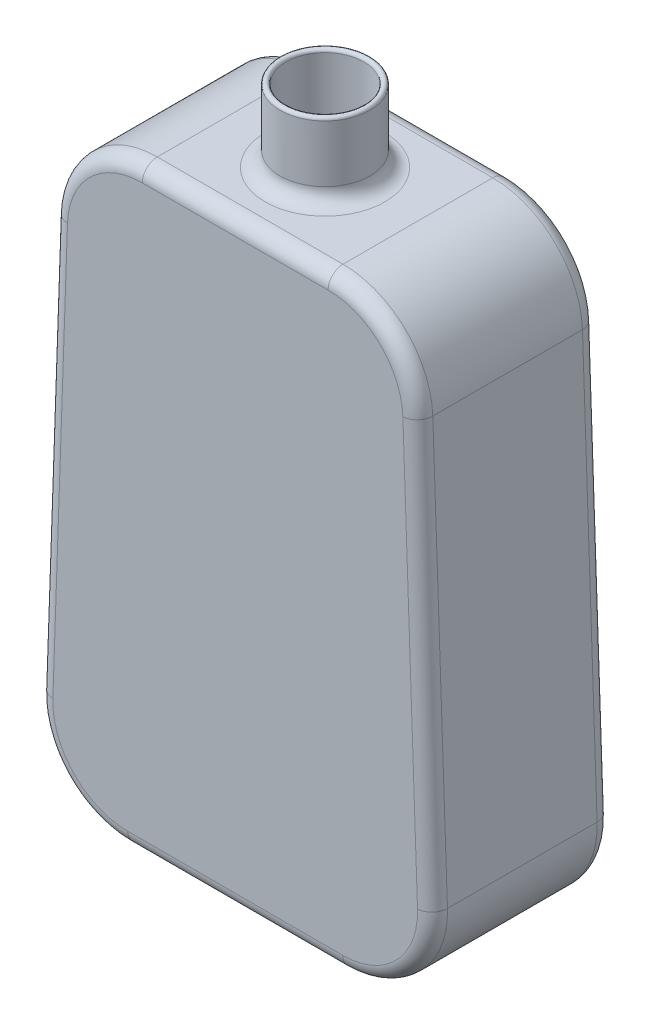
ISO-10303-21;
HEADER;
FILE_DESCRIPTION(('STEP AP214'),'2;1');
FILE_NAME('part.step','',(''),(''),'','','');
FILE_SCHEMA(('AUTOMOTIVE_DESIGN { 1 0 10303 214 1 1 1 1 }'));
ENDSEC;
DATA;
#1=APPLICATION_CONTEXT('core data for automotive mechanical design processes');
#2=APPLICATION_PROTOCOL_DEFINITION('international standard','automotive_design',2000,#1);
#3=PRODUCT_CONTEXT('',#1,'mechanical');
#4=PRODUCT('Part','Part','',(#3));
#5=PRODUCT_RELATED_PRODUCT_CATEGORY('part','',(#4));
#6=PRODUCT_DEFINITION_FORMATION('','',#4);
#7=PRODUCT_DEFINITION_CONTEXT('part definition',#1,'design');
#8=PRODUCT_DEFINITION('design','',#6,#7);
#9=PRODUCT_DEFINITION_SHAPE('','',#8);
#10=(LENGTH_UNIT() NAMED_UNIT(*) SI_UNIT(.MILLI.,.METRE.));
#11=(NAMED_UNIT(*) PLANE_ANGLE_UNIT() SI_UNIT($,.RADIAN.));
#12=(NAMED_UNIT(*) SI_UNIT($,.STERADIAN.) SOLID_ANGLE_UNIT());
#13=UNCERTAINTY_MEASURE_WITH_UNIT(LENGTH_MEASURE(1.E-05),#10,'distance_accuracy_value','');
#14=(GEOMETRIC_REPRESENTATION_CONTEXT(3) GLOBAL_UNCERTAINTY_ASSIGNED_CONTEXT((#13)) GLOBAL_UNIT_ASSIGNED_CONTEXT((#10,
#11,#12)) REPRESENTATION_CONTEXT('',''));
#15=CARTESIAN_POINT('',(0.,0.,0.));
#16=DIRECTION('',(0.,0.,1.));
#17=DIRECTION('',(1.,0.,0.));
#18=AXIS2_PLACEMENT_3D('',#15,#16,#17);
#19=CARTESIAN_POINT('',(0.,124.,0.));
#20=DIRECTION('',(0.,1.,0.));
#21=DIRECTION('',(-1.,0.,0.));
#22=AXIS2_PLACEMENT_3D('',#19,#20,#21);
#23=TOROIDAL_SURFACE('',#22,14.,1.);
#24=CARTESIAN_POINT('',(0.,124.,0.));
#25=DIRECTION('',(0.,1.,0.));
#26=DIRECTION('',(-1.,0.,0.));
#27=AXIS2_PLACEMENT_3D('',#24,#25,#26);
#28=CIRCLE('',#27,13.);
#29=CARTESIAN_POINT('',(-13.,124.,0.));
#30=VERTEX_POINT('',#29);
#31=EDGE_CURVE('E50',#30,#30,#28,.T.);
#32=ORIENTED_EDGE('',*,*,#31,.F.);
#33=EDGE_LOOP('',(#32));
#34=FACE_BOUND('',#33,.T.);
#35=CARTESIAN_POINT('',(0.,124.,0.));
#36=DIRECTION('',(0.,1.,0.));
#37=DIRECTION('',(-1.,0.,0.));
#38=AXIS2_PLACEMENT_3D('',#35,#36,#37);
#39=CIRCLE('',#38,15.);
#40=CARTESIAN_POINT('',(-15.,124.,0.));
#41=VERTEX_POINT('',#40);
#42=EDGE_CURVE('E11',#41,#41,#39,.F.);
#43=ORIENTED_EDGE('',*,*,#42,.F.);
#44=EDGE_LOOP('',(#43));
#45=FACE_BOUND('',#44,.T.);
#46=ADVANCED_FACE('F41',(#34,#45),#23,.T.);
#47=CARTESIAN_POINT('',(-60.,100.,30.));
#48=DIRECTION('',(0.999390827019096,-0.0348994967025008,0.));
#49=DIRECTION('',(0.0348994967025008,0.999390827019096,0.));
#50=AXIS2_PLACEMENT_3D('',#47,#48,#49);
#51=PLANE('',#50);
#52=DIRECTION('',(0.,0.,-1.));
#53=VECTOR('',#52,1.);
#54=CARTESIAN_POINT('',(-61.0110615663607,71.046984901075,30.));
#55=LINE('',#54,#53);
#56=CARTESIAN_POINT('',(-61.0110615663607,71.046984901075,25.));
#57=VERTEX_POINT('',#56);
#58=CARTESIAN_POINT('',(-61.0110615663607,71.046984901075,-25.));
#59=VERTEX_POINT('',#58);
#60=EDGE_CURVE('E330',#57,#59,#55,.T.);
#61=ORIENTED_EDGE('',*,*,#60,.T.);
#62=DIRECTION('',(-0.0348994967025008,-0.999390827019096,0.));
#63=VECTOR('',#62,1.);
#64=CARTESIAN_POINT('',(-60.,100.,-25.));
#65=LINE('',#64,#63);
#66=CARTESIAN_POINT('',(-65.8999692952053,-68.953015098925,-25.));
#67=VERTEX_POINT('',#66);
#68=EDGE_CURVE('E394',#59,#67,#65,.T.);
#69=ORIENTED_EDGE('',*,*,#68,.T.);
#70=DIRECTION('',(0.,0.,-1.));
#71=VECTOR('',#70,1.);
#72=CARTESIAN_POINT('',(-65.8999692952053,-68.953015098925,30.));
#73=LINE('',#72,#71);
#74=CARTESIAN_POINT('',(-65.8999692952053,-68.953015098925,25.));
#75=VERTEX_POINT('',#74);
#76=EDGE_CURVE('E314',#75,#67,#73,.T.);
#77=ORIENTED_EDGE('',*,*,#76,.F.);
#78=DIRECTION('',(-0.0348994967025008,-0.999390827019096,0.));
#79=VECTOR('',#78,1.);
#80=CARTESIAN_POINT('',(-61.0110615663607,71.046984901075,25.));
#81=LINE('',#80,#79);
#82=EDGE_CURVE('E391',#75,#57,#81,.F.);
#83=ORIENTED_EDGE('',*,*,#82,.T.);
#84=EDGE_LOOP('',(#61,#69,#77,#83));
#85=FACE_BOUND('',#84,.T.);
#86=ADVANCED_FACE('F507',(#85),#51,.F.);
#87=CARTESIAN_POINT('',(-35.9182444846325,-70.,30.));
#88=DIRECTION('',(0.,0.,-1.));
#89=DIRECTION('',(-1.,0.,0.));
#90=AXIS2_PLACEMENT_3D('',#87,#88,#89);
#91=CYLINDRICAL_SURFACE('',#90,30.);
#92=ORIENTED_EDGE('',*,*,#76,.T.);
#93=CARTESIAN_POINT('',(-35.9182444846325,-70.,-25.));
#94=DIRECTION('',(0.,0.,1.));
#95=DIRECTION('',(1.,0.,0.));
#96=AXIS2_PLACEMENT_3D('',#93,#94,#95);
#97=CIRCLE('',#96,30.);
#98=CARTESIAN_POINT('',(-35.9182444846325,-100.,-25.));
#99=VERTEX_POINT('',#98);
#100=EDGE_CURVE('E388',#67,#99,#97,.T.);
#101=ORIENTED_EDGE('',*,*,#100,.T.);
#102=DIRECTION('',(0.,0.,-1.));
#103=VECTOR('',#102,1.);
#104=CARTESIAN_POINT('',(-35.9182444846325,-100.,30.));
#105=LINE('',#104,#103);
#106=CARTESIAN_POINT('',(-35.9182444846325,-100.,25.));
#107=VERTEX_POINT('',#106);
#108=EDGE_CURVE('E310',#107,#99,#105,.T.);
#109=ORIENTED_EDGE('',*,*,#108,.F.);
#110=CARTESIAN_POINT('',(-35.9182444846325,-70.,25.));
#111=DIRECTION('',(0.,0.,1.));
#112=DIRECTION('',(1.,0.,0.));
#113=AXIS2_PLACEMENT_3D('',#110,#111,#112);
#114=CIRCLE('',#113,30.);
#115=EDGE_CURVE('E385',#107,#75,#114,.F.);
#116=ORIENTED_EDGE('',*,*,#115,.T.);
#117=EDGE_LOOP('',(#92,#101,#109,#116));
#118=FACE_BOUND('',#117,.T.);
#119=ADVANCED_FACE('F598',(#118),#91,.T.);
#120=CARTESIAN_POINT('',(-35.9182444846325,-100.,30.));
#121=DIRECTION('',(0.,1.,0.));
#122=DIRECTION('',(0.,0.,1.));
#123=AXIS2_PLACEMENT_3D('',#120,#121,#122);
#124=PLANE('',#123);
#125=ORIENTED_EDGE('',*,*,#108,.T.);
#126=DIRECTION('',(1.,0.,0.));
#127=VECTOR('',#126,1.);
#128=CARTESIAN_POINT('',(-35.9182444846325,-100.,-25.));
#129=LINE('',#128,#127);
#130=CARTESIAN_POINT('',(35.9182444846325,-100.,-25.));
#131=VERTEX_POINT('',#130);
#132=EDGE_CURVE('E382',#99,#131,#129,.T.);
#133=ORIENTED_EDGE('',*,*,#132,.T.);
#134=DIRECTION('',(0.,0.,-1.));
#135=VECTOR('',#134,1.);
#136=CARTESIAN_POINT('',(35.9182444846325,-100.,30.));
#137=LINE('',#136,#135);
#138=CARTESIAN_POINT('',(35.9182444846325,-100.,25.));
#139=VERTEX_POINT('',#138);
#140=EDGE_CURVE('E306',#139,#131,#137,.T.);
#141=ORIENTED_EDGE('',*,*,#140,.F.);
#142=DIRECTION('',(1.,0.,0.));
#143=VECTOR('',#142,1.);
#144=CARTESIAN_POINT('',(-35.9182444846325,-100.,25.));
#145=LINE('',#144,#143);
#146=EDGE_CURVE('E379',#139,#107,#145,.F.);
#147=ORIENTED_EDGE('',*,*,#146,.T.);
#148=EDGE_LOOP('',(#125,#133,#141,#147));
#149=FACE_BOUND('',#148,.T.);
#150=ADVANCED_FACE('F602',(#149),#124,.F.);
#151=CARTESIAN_POINT('',(35.9182444846325,-70.,30.));
#152=DIRECTION('',(0.,0.,-1.));
#153=DIRECTION('',(-1.,0.,0.));
#154=AXIS2_PLACEMENT_3D('',#151,#152,#153);
#155=CYLINDRICAL_SURFACE('',#154,30.);
#156=ORIENTED_EDGE('',*,*,#140,.T.);
#157=CARTESIAN_POINT('',(35.9182444846325,-70.,-25.));
#158=DIRECTION('',(0.,0.,1.));
#159=DIRECTION('',(1.,0.,0.));
#160=AXIS2_PLACEMENT_3D('',#157,#158,#159);
#161=CIRCLE('',#160,30.);
#162=CARTESIAN_POINT('',(65.8999692952053,-68.953015098925,-25.));
#163=VERTEX_POINT('',#162);
#164=EDGE_CURVE('E376',#131,#163,#161,.T.);
#165=ORIENTED_EDGE('',*,*,#164,.T.);
#166=DIRECTION('',(0.,0.,-1.));
#167=VECTOR('',#166,1.);
#168=CARTESIAN_POINT('',(65.8999692952053,-68.953015098925,30.));
#169=LINE('',#168,#167);
#170=CARTESIAN_POINT('',(65.8999692952053,-68.953015098925,25.));
#171=VERTEX_POINT('',#170);
#172=EDGE_CURVE('E291',#171,#163,#169,.T.);
#173=ORIENTED_EDGE('',*,*,#172,.F.);
#174=CARTESIAN_POINT('',(35.9182444846325,-70.,25.));
#175=DIRECTION('',(0.,0.,1.));
#176=DIRECTION('',(1.,0.,0.));
#177=AXIS2_PLACEMENT_3D('',#174,#175,#176);
#178=CIRCLE('',#177,30.);
#179=EDGE_CURVE('E373',#171,#139,#178,.F.);
#180=ORIENTED_EDGE('',*,*,#179,.T.);
#181=EDGE_LOOP('',(#156,#165,#173,#180));
#182=FACE_BOUND('',#181,.T.);
#183=ADVANCED_FACE('F606',(#182),#155,.T.);
#184=CARTESIAN_POINT('',(60.,100.,30.));
#185=DIRECTION('',(-0.999390827019096,-0.034899496702501,0.));
#186=DIRECTION('',(0.034899496702501,-0.999390827019096,0.));
#187=AXIS2_PLACEMENT_3D('',#184,#185,#186);
#188=PLANE('',#187);
#189=ORIENTED_EDGE('',*,*,#172,.T.);
#190=DIRECTION('',(-0.034899496702501,0.999390827019096,0.));
#191=VECTOR('',#190,1.);
#192=CARTESIAN_POINT('',(60.,100.,-25.));
#193=LINE('',#192,#191);
#194=CARTESIAN_POINT('',(61.0110615663606,71.046984901075,-25.));
#195=VERTEX_POINT('',#194);
#196=EDGE_CURVE('E370',#163,#195,#193,.T.);
#197=ORIENTED_EDGE('',*,*,#196,.T.);
#198=DIRECTION('',(0.,0.,-1.));
#199=VECTOR('',#198,1.);
#200=CARTESIAN_POINT('',(61.0110615663606,71.046984901075,30.));
#201=LINE('',#200,#199);
#202=CARTESIAN_POINT('',(61.0110615663606,71.046984901075,25.));
#203=VERTEX_POINT('',#202);
#204=EDGE_CURVE('E326',#195,#203,#201,.F.);
#205=ORIENTED_EDGE('',*,*,#204,.T.);
#206=DIRECTION('',(-0.034899496702501,0.999390827019096,0.));
#207=VECTOR('',#206,1.);
#208=CARTESIAN_POINT('',(65.8999692952053,-68.953015098925,25.));
#209=LINE('',#208,#207);
#210=EDGE_CURVE('E367',#203,#171,#209,.F.);
#211=ORIENTED_EDGE('',*,*,#210,.T.);
#212=EDGE_LOOP('',(#189,#197,#205,#211));
#213=FACE_BOUND('',#212,.T.);
#214=ADVANCED_FACE('F610',(#213),#188,.F.);
#215=CARTESIAN_POINT('',(60.,100.,30.));
#216=DIRECTION('',(0.,-1.,0.));
#217=DIRECTION('',(1.,0.,0.));
#218=AXIS2_PLACEMENT_3D('',#215,#216,#217);
#219=PLANE('',#218);
#220=CARTESIAN_POINT('',(0.,100.,0.));
#221=DIRECTION('',(0.,-1.,0.));
#222=DIRECTION('',(1.,0.,0.));
#223=AXIS2_PLACEMENT_3D('',#220,#221,#222);
#224=CIRCLE('',#223,20.);
#225=CARTESIAN_POINT('',(20.,100.,0.));
#226=VERTEX_POINT('',#225);
#227=EDGE_CURVE('E425',#226,#226,#224,.T.);
#228=ORIENTED_EDGE('',*,*,#227,.T.);
#229=EDGE_LOOP('',(#228));
#230=FACE_BOUND('',#229,.T.);
#231=DIRECTION('',(0.,0.,-1.));
#232=VECTOR('',#231,1.);
#233=CARTESIAN_POINT('',(31.0293367557878,100.,30.));
#234=LINE('',#233,#232);
#235=CARTESIAN_POINT('',(31.0293367557878,100.,25.));
#236=VERTEX_POINT('',#235);
#237=CARTESIAN_POINT('',(31.0293367557878,100.,-25.));
#238=VERTEX_POINT('',#237);
#239=EDGE_CURVE('E322',#236,#238,#234,.T.);
#240=ORIENTED_EDGE('',*,*,#239,.T.);
#241=DIRECTION('',(-1.,0.,0.));
#242=VECTOR('',#241,1.);
#243=CARTESIAN_POINT('',(60.,100.,-25.));
#244=LINE('',#243,#242);
#245=CARTESIAN_POINT('',(-31.0293367557878,100.,-25.));
#246=VERTEX_POINT('',#245);
#247=EDGE_CURVE('E432',#238,#246,#244,.T.);
#248=ORIENTED_EDGE('',*,*,#247,.T.);
#249=DIRECTION('',(0.,0.,-1.));
#250=VECTOR('',#249,1.);
#251=CARTESIAN_POINT('',(-31.0293367557878,100.,30.));
#252=LINE('',#251,#250);
#253=CARTESIAN_POINT('',(-31.0293367557878,100.,25.));
#254=VERTEX_POINT('',#253);
#255=EDGE_CURVE('E318',#246,#254,#252,.F.);
#256=ORIENTED_EDGE('',*,*,#255,.T.);
#257=DIRECTION('',(-1.,0.,0.));
#258=VECTOR('',#257,1.);
#259=CARTESIAN_POINT('',(31.0293367557878,100.,25.));
#260=LINE('',#259,#258);
#261=EDGE_CURVE('E429',#254,#236,#260,.F.);
#262=ORIENTED_EDGE('',*,*,#261,.T.);
#263=EDGE_LOOP('',(#240,#248,#256,#262));
#264=FACE_BOUND('',#263,.T.);
#265=ADVANCED_FACE('F614',(#230,#264),#219,.F.);
#266=CARTESIAN_POINT('',(-35.9182444846325,-70.,30.));
#267=DIRECTION('',(0.,0.,1.));
#268=DIRECTION('',(1.,0.,0.));
#269=AXIS2_PLACEMENT_3D('',#266,#267,#268);
#270=PLANE('',#269);
#271=DIRECTION('',(-0.034899496702501,0.999390827019096,0.));
#272=VECTOR('',#271,1.);
#273=CARTESIAN_POINT('',(56.0141074312652,70.8724874175626,30.));
#274=LINE('',#273,#272);
#275=CARTESIAN_POINT('',(60.9030151601099,-69.1275125824375,30.));
#276=VERTEX_POINT('',#275);
#277=CARTESIAN_POINT('',(56.0141074312652,70.8724874175625,30.));
#278=VERTEX_POINT('',#277);
#279=EDGE_CURVE('E57',#276,#278,#274,.T.);
#280=ORIENTED_EDGE('',*,*,#279,.T.);
#281=CARTESIAN_POINT('',(31.0293367557878,70.,30.));
#282=DIRECTION('',(0.,0.,1.));
#283=DIRECTION('',(1.,0.,0.));
#284=AXIS2_PLACEMENT_3D('',#281,#282,#283);
#285=CIRCLE('',#284,25.);
#286=CARTESIAN_POINT('',(31.0293367557878,95.,30.));
#287=VERTEX_POINT('',#286);
#288=EDGE_CURVE('E422',#278,#287,#285,.T.);
#289=ORIENTED_EDGE('',*,*,#288,.T.);
#290=DIRECTION('',(-1.,0.,0.));
#291=VECTOR('',#290,1.);
#292=CARTESIAN_POINT('',(-31.0293367557878,95.,30.));
#293=LINE('',#292,#291);
#294=CARTESIAN_POINT('',(-31.0293367557878,95.,30.));
#295=VERTEX_POINT('',#294);
#296=EDGE_CURVE('E403',#287,#295,#293,.T.);
#297=ORIENTED_EDGE('',*,*,#296,.T.);
#298=CARTESIAN_POINT('',(-31.0293367557878,70.,30.));
#299=DIRECTION('',(0.,0.,1.));
#300=DIRECTION('',(1.,0.,0.));
#301=AXIS2_PLACEMENT_3D('',#298,#299,#300);
#302=CIRCLE('',#301,25.);
#303=CARTESIAN_POINT('',(-56.0141074312652,70.8724874175625,30.));
#304=VERTEX_POINT('',#303);
#305=EDGE_CURVE('E406',#295,#304,#302,.T.);
#306=ORIENTED_EDGE('',*,*,#305,.T.);
#307=DIRECTION('',(-0.0348994967025008,-0.999390827019096,0.));
#308=VECTOR('',#307,1.);
#309=CARTESIAN_POINT('',(-60.9030151601098,-69.1275125824375,30.));
#310=LINE('',#309,#308);
#311=CARTESIAN_POINT('',(-60.9030151601098,-69.1275125824375,30.));
#312=VERTEX_POINT('',#311);
#313=EDGE_CURVE('E409',#304,#312,#310,.T.);
#314=ORIENTED_EDGE('',*,*,#313,.T.);
#315=CARTESIAN_POINT('',(-35.9182444846325,-70.,30.));
#316=DIRECTION('',(0.,0.,1.));
#317=DIRECTION('',(1.,0.,0.));
#318=AXIS2_PLACEMENT_3D('',#315,#316,#317);
#319=CIRCLE('',#318,25.);
#320=CARTESIAN_POINT('',(-35.9182444846325,-95.,30.));
#321=VERTEX_POINT('',#320);
#322=EDGE_CURVE('E412',#312,#321,#319,.T.);
#323=ORIENTED_EDGE('',*,*,#322,.T.);
#324=DIRECTION('',(1.,0.,0.));
#325=VECTOR('',#324,1.);
#326=CARTESIAN_POINT('',(35.9182444846325,-95.,30.));
#327=LINE('',#326,#325);
#328=CARTESIAN_POINT('',(35.9182444846325,-95.,30.));
#329=VERTEX_POINT('',#328);
#330=EDGE_CURVE('E415',#321,#329,#327,.T.);
#331=ORIENTED_EDGE('',*,*,#330,.T.);
#332=CARTESIAN_POINT('',(35.9182444846325,-70.,30.));
#333=DIRECTION('',(0.,0.,1.));
#334=DIRECTION('',(1.,0.,0.));
#335=AXIS2_PLACEMENT_3D('',#332,#333,#334);
#336=CIRCLE('',#335,25.);
#337=EDGE_CURVE('E62',#329,#276,#336,.T.);
#338=ORIENTED_EDGE('',*,*,#337,.T.);
#339=EDGE_LOOP('',(#280,#289,#297,#306,#314,#323,#331,#338));
#340=FACE_BOUND('',#339,.T.);
#341=ADVANCED_FACE('F618',(#340),#270,.T.);
#342=CARTESIAN_POINT('',(-35.9182444846325,-70.,-30.));
#343=DIRECTION('',(0.,0.,1.));
#344=DIRECTION('',(1.,0.,0.));
#345=AXIS2_PLACEMENT_3D('',#342,#343,#344);
#346=PLANE('',#345);
#347=DIRECTION('',(-1.,0.,0.));
#348=VECTOR('',#347,1.);
#349=CARTESIAN_POINT('',(-35.9182444846325,95.,-30.));
#350=LINE('',#349,#348);
#351=CARTESIAN_POINT('',(-31.0293367557878,95.,-30.));
#352=VERTEX_POINT('',#351);
#353=CARTESIAN_POINT('',(31.0293367557878,95.,-30.));
#354=VERTEX_POINT('',#353);
#355=EDGE_CURVE('E334',#352,#354,#350,.F.);
#356=ORIENTED_EDGE('',*,*,#355,.T.);
#357=CARTESIAN_POINT('',(31.0293367557878,70.,-30.));
#358=DIRECTION('',(0.,0.,1.));
#359=DIRECTION('',(1.,0.,0.));
#360=AXIS2_PLACEMENT_3D('',#357,#358,#359);
#361=CIRCLE('',#360,25.);
#362=CARTESIAN_POINT('',(56.0141074312652,70.8724874175625,-30.));
#363=VERTEX_POINT('',#362);
#364=EDGE_CURVE('E355',#354,#363,#361,.F.);
#365=ORIENTED_EDGE('',*,*,#364,.T.);
#366=DIRECTION('',(-0.034899496702501,0.999390827019096,0.));
#367=VECTOR('',#366,1.);
#368=CARTESIAN_POINT('',(60.8155201217899,-66.6219825041101,-30.));
#369=LINE('',#368,#367);
#370=CARTESIAN_POINT('',(60.9030151601099,-69.1275125824375,-30.));
#371=VERTEX_POINT('',#370);
#372=EDGE_CURVE('E352',#363,#371,#369,.F.);
#373=ORIENTED_EDGE('',*,*,#372,.T.);
#374=CARTESIAN_POINT('',(35.9182444846325,-70.,-30.));
#375=DIRECTION('',(0.,0.,1.));
#376=DIRECTION('',(1.,0.,0.));
#377=AXIS2_PLACEMENT_3D('',#374,#375,#376);
#378=CIRCLE('',#377,25.);
#379=CARTESIAN_POINT('',(35.9182444846325,-95.,-30.));
#380=VERTEX_POINT('',#379);
#381=EDGE_CURVE('E349',#371,#380,#378,.F.);
#382=ORIENTED_EDGE('',*,*,#381,.T.);
#383=DIRECTION('',(1.,0.,0.));
#384=VECTOR('',#383,1.);
#385=CARTESIAN_POINT('',(-35.9182444846325,-95.,-30.));
#386=LINE('',#385,#384);
#387=CARTESIAN_POINT('',(-35.9182444846325,-95.,-30.));
#388=VERTEX_POINT('',#387);
#389=EDGE_CURVE('E346',#380,#388,#386,.F.);
#390=ORIENTED_EDGE('',*,*,#389,.T.);
#391=CARTESIAN_POINT('',(-35.9182444846325,-70.,-30.));
#392=DIRECTION('',(0.,0.,1.));
#393=DIRECTION('',(1.,0.,0.));
#394=AXIS2_PLACEMENT_3D('',#391,#392,#393);
#395=CIRCLE('',#394,25.);
#396=CARTESIAN_POINT('',(-60.9030151601098,-69.1275125824375,-30.));
#397=VERTEX_POINT('',#396);
#398=EDGE_CURVE('E343',#388,#397,#395,.F.);
#399=ORIENTED_EDGE('',*,*,#398,.T.);
#400=DIRECTION('',(-0.0348994967025008,-0.999390827019096,0.));
#401=VECTOR('',#400,1.);
#402=CARTESIAN_POINT('',(-60.9030151601098,-69.1275125824375,-30.));
#403=LINE('',#402,#401);
#404=CARTESIAN_POINT('',(-56.0141074312652,70.8724874175625,-30.));
#405=VERTEX_POINT('',#404);
#406=EDGE_CURVE('E340',#397,#405,#403,.F.);
#407=ORIENTED_EDGE('',*,*,#406,.T.);
#408=CARTESIAN_POINT('',(-31.0293367557878,70.,-30.));
#409=DIRECTION('',(0.,0.,1.));
#410=DIRECTION('',(1.,0.,0.));
#411=AXIS2_PLACEMENT_3D('',#408,#409,#410);
#412=CIRCLE('',#411,25.);
#413=EDGE_CURVE('E337',#405,#352,#412,.F.);
#414=ORIENTED_EDGE('',*,*,#413,.T.);
#415=EDGE_LOOP('',(#356,#365,#373,#382,#390,#399,#407,#414));
#416=FACE_BOUND('',#415,.T.);
#417=ADVANCED_FACE('F594',(#416),#346,.F.);
#418=CARTESIAN_POINT('',(31.0293367557878,70.,30.));
#419=DIRECTION('',(0.,0.,-1.));
#420=DIRECTION('',(-1.,0.,0.));
#421=AXIS2_PLACEMENT_3D('',#418,#419,#420);
#422=CYLINDRICAL_SURFACE('',#421,30.);
#423=ORIENTED_EDGE('',*,*,#204,.F.);
#424=CARTESIAN_POINT('',(31.0293367557878,70.,-25.));
#425=DIRECTION('',(0.,0.,1.));
#426=DIRECTION('',(1.,0.,0.));
#427=AXIS2_PLACEMENT_3D('',#424,#425,#426);
#428=CIRCLE('',#427,30.);
#429=EDGE_CURVE('E363',#195,#238,#428,.T.);
#430=ORIENTED_EDGE('',*,*,#429,.T.);
#431=ORIENTED_EDGE('',*,*,#239,.F.);
#432=CARTESIAN_POINT('',(31.0293367557878,70.,25.));
#433=DIRECTION('',(0.,0.,1.));
#434=DIRECTION('',(1.,0.,0.));
#435=AXIS2_PLACEMENT_3D('',#432,#433,#434);
#436=CIRCLE('',#435,30.);
#437=EDGE_CURVE('E359',#236,#203,#436,.F.);
#438=ORIENTED_EDGE('',*,*,#437,.T.);
#439=EDGE_LOOP('',(#423,#430,#431,#438));
#440=FACE_BOUND('',#439,.T.);
#441=ADVANCED_FACE('F590',(#440),#422,.T.);
#442=CARTESIAN_POINT('',(-31.0293367557878,70.,30.));
#443=DIRECTION('',(0.,0.,-1.));
#444=DIRECTION('',(-1.,0.,0.));
#445=AXIS2_PLACEMENT_3D('',#442,#443,#444);
#446=CYLINDRICAL_SURFACE('',#445,30.);
#447=ORIENTED_EDGE('',*,*,#255,.F.);
#448=CARTESIAN_POINT('',(-31.0293367557878,70.,-25.));
#449=DIRECTION('',(0.,0.,1.));
#450=DIRECTION('',(1.,0.,0.));
#451=AXIS2_PLACEMENT_3D('',#448,#449,#450);
#452=CIRCLE('',#451,30.);
#453=EDGE_CURVE('E400',#246,#59,#452,.T.);
#454=ORIENTED_EDGE('',*,*,#453,.T.);
#455=ORIENTED_EDGE('',*,*,#60,.F.);
#456=CARTESIAN_POINT('',(-31.0293367557878,70.,25.));
#457=DIRECTION('',(0.,0.,1.));
#458=DIRECTION('',(1.,0.,0.));
#459=AXIS2_PLACEMENT_3D('',#456,#457,#458);
#460=CIRCLE('',#459,30.);
#461=EDGE_CURVE('E397',#57,#254,#460,.F.);
#462=ORIENTED_EDGE('',*,*,#461,.T.);
#463=EDGE_LOOP('',(#447,#454,#455,#462));
#464=FACE_BOUND('',#463,.T.);
#465=ADVANCED_FACE('F513',(#464),#446,.T.);
#466=CARTESIAN_POINT('',(0.,125.,0.));
#467=DIRECTION('',(0.,-1.,0.));
#468=DIRECTION('',(1.,0.,0.));
#469=AXIS2_PLACEMENT_3D('',#466,#467,#468);
#470=CYLINDRICAL_SURFACE('',#469,15.);
#471=ORIENTED_EDGE('',*,*,#42,.T.);
#472=EDGE_LOOP('',(#471));
#473=FACE_BOUND('',#472,.T.);
#474=CARTESIAN_POINT('',(0.,105.,0.));
#475=DIRECTION('',(0.,-1.,0.));
#476=DIRECTION('',(1.,0.,0.));
#477=AXIS2_PLACEMENT_3D('',#474,#475,#476);
#478=CIRCLE('',#477,15.);
#479=CARTESIAN_POINT('',(15.,105.,0.));
#480=VERTEX_POINT('',#479);
#481=EDGE_CURVE('E435',#480,#480,#478,.F.);
#482=ORIENTED_EDGE('',*,*,#481,.T.);
#483=EDGE_LOOP('',(#482));
#484=FACE_BOUND('',#483,.T.);
#485=ADVANCED_FACE('F510',(#473,#484),#470,.T.);
#486=CARTESIAN_POINT('',(-58.0012183459618,99.930201006595,30.));
#487=DIRECTION('',(0.999390827019096,-0.0348994967025008,0.));
#488=DIRECTION('',(0.0348994967025008,0.999390827019096,0.));
#489=AXIS2_PLACEMENT_3D('',#486,#487,#488);
#490=PLANE('',#489);
#491=DIRECTION('',(-0.0348994967025008,-0.999390827019096,0.));
#492=VECTOR('',#491,1.);
#493=CARTESIAN_POINT('',(-58.0012183459618,99.930201006595,28.));
#494=LINE('',#493,#492);
#495=CARTESIAN_POINT('',(-59.0122799123225,70.97718590767,28.));
#496=VERTEX_POINT('',#495);
#497=CARTESIAN_POINT('',(-63.9011876411671,-69.02281409233,28.));
#498=VERTEX_POINT('',#497);
#499=EDGE_CURVE('E204',#496,#498,#494,.T.);
#500=ORIENTED_EDGE('',*,*,#499,.T.);
#501=DIRECTION('',(0.,0.,-1.));
#502=VECTOR('',#501,1.);
#503=CARTESIAN_POINT('',(-63.9011876411671,-69.02281409233,30.));
#504=LINE('',#503,#502);
#505=CARTESIAN_POINT('',(-63.9011876411671,-69.02281409233,-28.));
#506=VERTEX_POINT('',#505);
#507=EDGE_CURVE('E209',#498,#506,#504,.T.);
#508=ORIENTED_EDGE('',*,*,#507,.T.);
#509=DIRECTION('',(-0.0348994967025008,-0.999390827019096,0.));
#510=VECTOR('',#509,1.);
#511=CARTESIAN_POINT('',(-58.0012183459618,99.930201006595,-28.));
#512=LINE('',#511,#510);
#513=CARTESIAN_POINT('',(-59.0122799123225,70.97718590767,-28.));
#514=VERTEX_POINT('',#513);
#515=EDGE_CURVE('E243',#514,#506,#512,.T.);
#516=ORIENTED_EDGE('',*,*,#515,.F.);
#517=DIRECTION('',(0.,0.,1.));
#518=VECTOR('',#517,1.);
#519=CARTESIAN_POINT('',(-59.0122799123225,70.97718590767,30.));
#520=LINE('',#519,#518);
#521=EDGE_CURVE('E211',#496,#514,#520,.F.);
#522=ORIENTED_EDGE('',*,*,#521,.F.);
#523=EDGE_LOOP('',(#500,#508,#516,#522));
#524=FACE_BOUND('',#523,.T.);
#525=ADVANCED_FACE('F206',(#524),#490,.T.);
#526=CARTESIAN_POINT('',(-35.9182444846325,-70.,30.));
#527=DIRECTION('',(0.,0.,-1.));
#528=DIRECTION('',(-1.,0.,0.));
#529=AXIS2_PLACEMENT_3D('',#526,#527,#528);
#530=CYLINDRICAL_SURFACE('',#529,28.);
#531=CARTESIAN_POINT('',(-35.9182444846325,-70.,-28.));
#532=DIRECTION('',(0.,0.,1.));
#533=DIRECTION('',(1.,0.,0.));
#534=AXIS2_PLACEMENT_3D('',#531,#532,#533);
#535=CIRCLE('',#534,28.);
#536=CARTESIAN_POINT('',(-35.9182444846325,-98.,-28.));
#537=VERTEX_POINT('',#536);
#538=EDGE_CURVE('E230',#506,#537,#535,.T.);
#539=ORIENTED_EDGE('',*,*,#538,.F.);
#540=ORIENTED_EDGE('',*,*,#507,.F.);
#541=CARTESIAN_POINT('',(-35.9182444846325,-70.,28.));
#542=DIRECTION('',(0.,0.,1.));
#543=DIRECTION('',(1.,0.,0.));
#544=AXIS2_PLACEMENT_3D('',#541,#542,#543);
#545=CIRCLE('',#544,28.);
#546=CARTESIAN_POINT('',(-35.9182444846325,-98.,28.));
#547=VERTEX_POINT('',#546);
#548=EDGE_CURVE('E215',#498,#547,#545,.T.);
#549=ORIENTED_EDGE('',*,*,#548,.T.);
#550=DIRECTION('',(0.,0.,1.));
#551=VECTOR('',#550,1.);
#552=CARTESIAN_POINT('',(-35.9182444846325,-98.,30.));
#553=LINE('',#552,#551);
#554=EDGE_CURVE('E233',#547,#537,#553,.F.);
#555=ORIENTED_EDGE('',*,*,#554,.T.);
#556=EDGE_LOOP('',(#539,#540,#549,#555));
#557=FACE_BOUND('',#556,.T.);
#558=ADVANCED_FACE('F229',(#557),#530,.F.);
#559=CARTESIAN_POINT('',(-35.9182444846325,-98.,30.));
#560=DIRECTION('',(0.,1.,0.));
#561=DIRECTION('',(0.,0.,1.));
#562=AXIS2_PLACEMENT_3D('',#559,#560,#561);
#563=PLANE('',#562);
#564=DIRECTION('',(1.,0.,0.));
#565=VECTOR('',#564,1.);
#566=CARTESIAN_POINT('',(-35.9182444846325,-98.,-28.));
#567=LINE('',#566,#565);
#568=CARTESIAN_POINT('',(35.9182444846325,-98.,-28.));
#569=VERTEX_POINT('',#568);
#570=EDGE_CURVE('E246',#537,#569,#567,.T.);
#571=ORIENTED_EDGE('',*,*,#570,.F.);
#572=ORIENTED_EDGE('',*,*,#554,.F.);
#573=DIRECTION('',(1.,0.,0.));
#574=VECTOR('',#573,1.);
#575=CARTESIAN_POINT('',(-35.9182444846325,-98.,28.));
#576=LINE('',#575,#574);
#577=CARTESIAN_POINT('',(35.9182444846325,-98.,28.));
#578=VERTEX_POINT('',#577);
#579=EDGE_CURVE('E222',#547,#578,#576,.T.);
#580=ORIENTED_EDGE('',*,*,#579,.T.);
#581=DIRECTION('',(0.,0.,-1.));
#582=VECTOR('',#581,1.);
#583=CARTESIAN_POINT('',(35.9182444846325,-98.,30.));
#584=LINE('',#583,#582);
#585=EDGE_CURVE('E239',#578,#569,#584,.T.);
#586=ORIENTED_EDGE('',*,*,#585,.T.);
#587=EDGE_LOOP('',(#571,#572,#580,#586));
#588=FACE_BOUND('',#587,.T.);
#589=ADVANCED_FACE('F652',(#588),#563,.T.);
#590=CARTESIAN_POINT('',(35.9182444846325,-70.,30.));
#591=DIRECTION('',(0.,0.,-1.));
#592=DIRECTION('',(-1.,0.,0.));
#593=AXIS2_PLACEMENT_3D('',#590,#591,#592);
#594=CYLINDRICAL_SURFACE('',#593,28.);
#595=CARTESIAN_POINT('',(35.9182444846325,-70.,-28.));
#596=DIRECTION('',(0.,0.,1.));
#597=DIRECTION('',(1.,0.,0.));
#598=AXIS2_PLACEMENT_3D('',#595,#596,#597);
#599=CIRCLE('',#598,28.);
#600=CARTESIAN_POINT('',(63.9011876411671,-69.02281409233,-28.));
#601=VERTEX_POINT('',#600);
#602=EDGE_CURVE('E250',#569,#601,#599,.T.);
#603=ORIENTED_EDGE('',*,*,#602,.F.);
#604=ORIENTED_EDGE('',*,*,#585,.F.);
#605=CARTESIAN_POINT('',(35.9182444846325,-70.,28.));
#606=DIRECTION('',(0.,0.,1.));
#607=DIRECTION('',(1.,0.,0.));
#608=AXIS2_PLACEMENT_3D('',#605,#606,#607);
#609=CIRCLE('',#608,28.);
#610=CARTESIAN_POINT('',(63.9011876411671,-69.02281409233,28.));
#611=VERTEX_POINT('',#610);
#612=EDGE_CURVE('E257',#578,#611,#609,.T.);
#613=ORIENTED_EDGE('',*,*,#612,.T.);
#614=DIRECTION('',(0.,0.,1.));
#615=VECTOR('',#614,1.);
#616=CARTESIAN_POINT('',(63.9011876411671,-69.02281409233,30.));
#617=LINE('',#616,#615);
#618=EDGE_CURVE('E254',#611,#601,#617,.F.);
#619=ORIENTED_EDGE('',*,*,#618,.T.);
#620=EDGE_LOOP('',(#603,#604,#613,#619));
#621=FACE_BOUND('',#620,.T.);
#622=ADVANCED_FACE('F648',(#621),#594,.F.);
#623=CARTESIAN_POINT('',(58.0012183459618,99.930201006595,30.));
#624=DIRECTION('',(-0.999390827019096,-0.034899496702501,0.));
#625=DIRECTION('',(0.034899496702501,-0.999390827019096,0.));
#626=AXIS2_PLACEMENT_3D('',#623,#624,#625);
#627=PLANE('',#626);
#628=DIRECTION('',(-0.034899496702501,0.999390827019096,0.));
#629=VECTOR('',#628,1.);
#630=CARTESIAN_POINT('',(58.0012183459618,99.930201006595,-28.));
#631=LINE('',#630,#629);
#632=CARTESIAN_POINT('',(59.0122799123225,70.97718590767,-28.));
#633=VERTEX_POINT('',#632);
#634=EDGE_CURVE('E260',#601,#633,#631,.T.);
#635=ORIENTED_EDGE('',*,*,#634,.F.);
#636=ORIENTED_EDGE('',*,*,#618,.F.);
#637=DIRECTION('',(-0.034899496702501,0.999390827019096,0.));
#638=VECTOR('',#637,1.);
#639=CARTESIAN_POINT('',(58.0012183459618,99.930201006595,28.));
#640=LINE('',#639,#638);
#641=CARTESIAN_POINT('',(59.0122799123225,70.97718590767,28.));
#642=VERTEX_POINT('',#641);
#643=EDGE_CURVE('E267',#611,#642,#640,.T.);
#644=ORIENTED_EDGE('',*,*,#643,.T.);
#645=DIRECTION('',(0.,0.,1.));
#646=VECTOR('',#645,1.);
#647=CARTESIAN_POINT('',(59.0122799123225,70.97718590767,30.));
#648=LINE('',#647,#646);
#649=EDGE_CURVE('E271',#633,#642,#648,.T.);
#650=ORIENTED_EDGE('',*,*,#649,.F.);
#651=EDGE_LOOP('',(#635,#636,#644,#650));
#652=FACE_BOUND('',#651,.T.);
#653=ADVANCED_FACE('F644',(#652),#627,.T.);
#654=CARTESIAN_POINT('',(60.,98.,30.));
#655=DIRECTION('',(0.,-1.,0.));
#656=DIRECTION('',(1.,0.,0.));
#657=AXIS2_PLACEMENT_3D('',#654,#655,#656);
#658=PLANE('',#657);
#659=CARTESIAN_POINT('',(0.,98.,0.));
#660=DIRECTION('',(0.,-1.,0.));
#661=DIRECTION('',(1.,0.,0.));
#662=AXIS2_PLACEMENT_3D('',#659,#660,#661);
#663=CIRCLE('',#662,13.);
#664=CARTESIAN_POINT('',(13.,98.,0.));
#665=VERTEX_POINT('',#664);
#666=EDGE_CURVE('E287',#665,#665,#663,.F.);
#667=ORIENTED_EDGE('',*,*,#666,.T.);
#668=EDGE_LOOP('',(#667));
#669=FACE_BOUND('',#668,.T.);
#670=DIRECTION('',(-1.,0.,0.));
#671=VECTOR('',#670,1.);
#672=CARTESIAN_POINT('',(60.,98.,28.));
#673=LINE('',#672,#671);
#674=CARTESIAN_POINT('',(31.0293367557878,98.,28.));
#675=VERTEX_POINT('',#674);
#676=CARTESIAN_POINT('',(-31.0293367557878,98.,28.));
#677=VERTEX_POINT('',#676);
#678=EDGE_CURVE('E264',#675,#677,#673,.T.);
#679=ORIENTED_EDGE('',*,*,#678,.T.);
#680=DIRECTION('',(0.,0.,1.));
#681=VECTOR('',#680,1.);
#682=CARTESIAN_POINT('',(-31.0293367557878,98.,30.));
#683=LINE('',#682,#681);
#684=CARTESIAN_POINT('',(-31.0293367557878,98.,-28.));
#685=VERTEX_POINT('',#684);
#686=EDGE_CURVE('E232',#685,#677,#683,.T.);
#687=ORIENTED_EDGE('',*,*,#686,.F.);
#688=DIRECTION('',(-1.,0.,0.));
#689=VECTOR('',#688,1.);
#690=CARTESIAN_POINT('',(60.,98.,-28.));
#691=LINE('',#690,#689);
#692=CARTESIAN_POINT('',(31.0293367557878,98.,-28.));
#693=VERTEX_POINT('',#692);
#694=EDGE_CURVE('E216',#693,#685,#691,.T.);
#695=ORIENTED_EDGE('',*,*,#694,.F.);
#696=DIRECTION('',(0.,0.,1.));
#697=VECTOR('',#696,1.);
#698=CARTESIAN_POINT('',(31.0293367557878,98.,30.));
#699=LINE('',#698,#697);
#700=EDGE_CURVE('E237',#675,#693,#699,.F.);
#701=ORIENTED_EDGE('',*,*,#700,.F.);
#702=EDGE_LOOP('',(#679,#687,#695,#701));
#703=FACE_BOUND('',#702,.T.);
#704=ADVANCED_FACE('F641',(#669,#703),#658,.T.);
#705=CARTESIAN_POINT('',(-35.9182444846325,-70.,28.));
#706=DIRECTION('',(0.,0.,1.));
#707=DIRECTION('',(1.,0.,0.));
#708=AXIS2_PLACEMENT_3D('',#705,#706,#707);
#709=PLANE('',#708);
#710=ORIENTED_EDGE('',*,*,#643,.F.);
#711=ORIENTED_EDGE('',*,*,#612,.F.);
#712=ORIENTED_EDGE('',*,*,#579,.F.);
#713=ORIENTED_EDGE('',*,*,#548,.F.);
#714=ORIENTED_EDGE('',*,*,#499,.F.);
#715=CARTESIAN_POINT('',(-31.0293367557878,70.,28.));
#716=DIRECTION('',(0.,0.,1.));
#717=DIRECTION('',(1.,0.,0.));
#718=AXIS2_PLACEMENT_3D('',#715,#716,#717);
#719=CIRCLE('',#718,28.);
#720=EDGE_CURVE('E274',#677,#496,#719,.T.);
#721=ORIENTED_EDGE('',*,*,#720,.F.);
#722=ORIENTED_EDGE('',*,*,#678,.F.);
#723=CARTESIAN_POINT('',(31.0293367557878,70.,28.));
#724=DIRECTION('',(0.,0.,1.));
#725=DIRECTION('',(1.,0.,0.));
#726=AXIS2_PLACEMENT_3D('',#723,#724,#725);
#727=CIRCLE('',#726,28.);
#728=EDGE_CURVE('E279',#642,#675,#727,.T.);
#729=ORIENTED_EDGE('',*,*,#728,.F.);
#730=EDGE_LOOP('',(#710,#711,#712,#713,#714,#721,#722,#729));
#731=FACE_BOUND('',#730,.T.);
#732=ADVANCED_FACE('F220',(#731),#709,.F.);
#733=CARTESIAN_POINT('',(-35.9182444846325,-70.,-28.));
#734=DIRECTION('',(0.,0.,1.));
#735=DIRECTION('',(1.,0.,0.));
#736=AXIS2_PLACEMENT_3D('',#733,#734,#735);
#737=PLANE('',#736);
#738=ORIENTED_EDGE('',*,*,#694,.T.);
#739=CARTESIAN_POINT('',(-31.0293367557878,70.,-28.));
#740=DIRECTION('',(0.,0.,1.));
#741=DIRECTION('',(1.,0.,0.));
#742=AXIS2_PLACEMENT_3D('',#739,#740,#741);
#743=CIRCLE('',#742,28.);
#744=EDGE_CURVE('E295',#514,#685,#743,.F.);
#745=ORIENTED_EDGE('',*,*,#744,.F.);
#746=ORIENTED_EDGE('',*,*,#515,.T.);
#747=ORIENTED_EDGE('',*,*,#538,.T.);
#748=ORIENTED_EDGE('',*,*,#570,.T.);
#749=ORIENTED_EDGE('',*,*,#602,.T.);
#750=ORIENTED_EDGE('',*,*,#634,.T.);
#751=CARTESIAN_POINT('',(31.0293367557878,70.,-28.));
#752=DIRECTION('',(0.,0.,1.));
#753=DIRECTION('',(1.,0.,0.));
#754=AXIS2_PLACEMENT_3D('',#751,#752,#753);
#755=CIRCLE('',#754,28.);
#756=EDGE_CURVE('E275',#693,#633,#755,.F.);
#757=ORIENTED_EDGE('',*,*,#756,.F.);
#758=EDGE_LOOP('',(#738,#745,#746,#747,#748,#749,#750,#757));
#759=FACE_BOUND('',#758,.T.);
#760=ADVANCED_FACE('F634',(#759),#737,.T.);
#761=CARTESIAN_POINT('',(31.0293367557878,70.,30.));
#762=DIRECTION('',(0.,0.,-1.));
#763=DIRECTION('',(-1.,0.,0.));
#764=AXIS2_PLACEMENT_3D('',#761,#762,#763);
#765=CYLINDRICAL_SURFACE('',#764,28.);
#766=ORIENTED_EDGE('',*,*,#728,.T.);
#767=ORIENTED_EDGE('',*,*,#700,.T.);
#768=ORIENTED_EDGE('',*,*,#756,.T.);
#769=ORIENTED_EDGE('',*,*,#649,.T.);
#770=EDGE_LOOP('',(#766,#767,#768,#769));
#771=FACE_BOUND('',#770,.T.);
#772=ADVANCED_FACE('F630',(#771),#765,.F.);
#773=CARTESIAN_POINT('',(-31.0293367557878,70.,30.));
#774=DIRECTION('',(0.,0.,-1.));
#775=DIRECTION('',(-1.,0.,0.));
#776=AXIS2_PLACEMENT_3D('',#773,#774,#775);
#777=CYLINDRICAL_SURFACE('',#776,28.);
#778=ORIENTED_EDGE('',*,*,#720,.T.);
#779=ORIENTED_EDGE('',*,*,#521,.T.);
#780=ORIENTED_EDGE('',*,*,#744,.T.);
#781=ORIENTED_EDGE('',*,*,#686,.T.);
#782=EDGE_LOOP('',(#778,#779,#780,#781));
#783=FACE_BOUND('',#782,.T.);
#784=ADVANCED_FACE('F627',(#783),#777,.F.);
#785=CARTESIAN_POINT('',(0.,125.,0.));
#786=DIRECTION('',(0.,-1.,0.));
#787=DIRECTION('',(1.,0.,0.));
#788=AXIS2_PLACEMENT_3D('',#785,#786,#787);
#789=CYLINDRICAL_SURFACE('',#788,13.);
#790=ORIENTED_EDGE('',*,*,#31,.T.);
#791=EDGE_LOOP('',(#790));
#792=FACE_BOUND('',#791,.T.);
#793=ORIENTED_EDGE('',*,*,#666,.F.);
#794=EDGE_LOOP('',(#793));
#795=FACE_BOUND('',#794,.T.);
#796=ADVANCED_FACE('F502',(#792,#795),#789,.F.);
#797=CARTESIAN_POINT('',(-35.9182444846325,-70.,-25.));
#798=DIRECTION('',(0.,0.,1.));
#799=DIRECTION('',(1.,0.,0.));
#800=AXIS2_PLACEMENT_3D('',#797,#798,#799);
#801=TOROIDAL_SURFACE('',#800,25.,5.);
#802=CARTESIAN_POINT('',(-35.9182444846325,-95.,-25.));
#803=DIRECTION('',(1.,0.,0.));
#804=DIRECTION('',(0.,0.,-1.));
#805=AXIS2_PLACEMENT_3D('',#802,#803,#804);
#806=CIRCLE('',#805,5.);
#807=EDGE_CURVE('E462',#99,#388,#806,.T.);
#808=ORIENTED_EDGE('',*,*,#807,.F.);
#809=ORIENTED_EDGE('',*,*,#100,.F.);
#810=CARTESIAN_POINT('',(-60.9030151601098,-69.1275125824375,-25.));
#811=DIRECTION('',(0.0348994967025007,0.999390827019096,0.));
#812=DIRECTION('',(-0.999390827019096,0.0348994967025007,0.));
#813=AXIS2_PLACEMENT_3D('',#810,#811,#812);
#814=CIRCLE('',#813,5.);
#815=EDGE_CURVE('E466',#397,#67,#814,.T.);
#816=ORIENTED_EDGE('',*,*,#815,.F.);
#817=ORIENTED_EDGE('',*,*,#398,.F.);
#818=EDGE_LOOP('',(#808,#809,#816,#817));
#819=FACE_BOUND('',#818,.T.);
#820=ADVANCED_FACE('F557',(#819),#801,.T.);
#821=CARTESIAN_POINT('',(-55.0030458649045,99.8255025164875,-25.));
#822=DIRECTION('',(-0.0348994967025008,-0.999390827019096,0.));
#823=DIRECTION('',(0.999390827019096,-0.0348994967025008,0.));
#824=AXIS2_PLACEMENT_3D('',#821,#822,#823);
#825=CYLINDRICAL_SURFACE('',#824,5.);
#826=ORIENTED_EDGE('',*,*,#815,.T.);
#827=ORIENTED_EDGE('',*,*,#68,.F.);
#828=CARTESIAN_POINT('',(-56.0141074312652,70.8724874175625,-25.));
#829=DIRECTION('',(0.0348994967025007,0.999390827019096,0.));
#830=DIRECTION('',(-0.999390827019096,0.0348994967025007,0.));
#831=AXIS2_PLACEMENT_3D('',#828,#829,#830);
#832=CIRCLE('',#831,5.);
#833=EDGE_CURVE('E458',#405,#59,#832,.T.);
#834=ORIENTED_EDGE('',*,*,#833,.F.);
#835=ORIENTED_EDGE('',*,*,#406,.F.);
#836=EDGE_LOOP('',(#826,#827,#834,#835));
#837=FACE_BOUND('',#836,.T.);
#838=ADVANCED_FACE('F560',(#837),#825,.T.);
#839=CARTESIAN_POINT('',(-35.9182444846325,-95.,-25.));
#840=DIRECTION('',(1.,0.,0.));
#841=DIRECTION('',(0.,0.,-1.));
#842=AXIS2_PLACEMENT_3D('',#839,#840,#841);
#843=CYLINDRICAL_SURFACE('',#842,5.);
#844=ORIENTED_EDGE('',*,*,#807,.T.);
#845=ORIENTED_EDGE('',*,*,#389,.F.);
#846=CARTESIAN_POINT('',(35.9182444846325,-95.,-25.));
#847=DIRECTION('',(1.,0.,0.));
#848=DIRECTION('',(0.,0.,-1.));
#849=AXIS2_PLACEMENT_3D('',#846,#847,#848);
#850=CIRCLE('',#849,5.);
#851=EDGE_CURVE('E454',#131,#380,#850,.T.);
#852=ORIENTED_EDGE('',*,*,#851,.F.);
#853=ORIENTED_EDGE('',*,*,#132,.F.);
#854=EDGE_LOOP('',(#844,#845,#852,#853));
#855=FACE_BOUND('',#854,.T.);
#856=ADVANCED_FACE('F564',(#855),#843,.T.);
#857=CARTESIAN_POINT('',(-31.0293367557878,70.,-25.));
#858=DIRECTION('',(0.,0.,1.));
#859=DIRECTION('',(1.,0.,0.));
#860=AXIS2_PLACEMENT_3D('',#857,#858,#859);
#861=TOROIDAL_SURFACE('',#860,25.,5.);
#862=ORIENTED_EDGE('',*,*,#833,.T.);
#863=ORIENTED_EDGE('',*,*,#453,.F.);
#864=CARTESIAN_POINT('',(-31.0293367557878,95.,-25.));
#865=DIRECTION('',(1.,0.,0.));
#866=DIRECTION('',(0.,0.,-1.));
#867=AXIS2_PLACEMENT_3D('',#864,#865,#866);
#868=CIRCLE('',#867,5.);
#869=EDGE_CURVE('E450',#352,#246,#868,.T.);
#870=ORIENTED_EDGE('',*,*,#869,.F.);
#871=ORIENTED_EDGE('',*,*,#413,.F.);
#872=EDGE_LOOP('',(#862,#863,#870,#871));
#873=FACE_BOUND('',#872,.T.);
#874=ADVANCED_FACE('F568',(#873),#861,.T.);
#875=CARTESIAN_POINT('',(35.9182444846325,-70.,-25.));
#876=DIRECTION('',(0.,0.,1.));
#877=DIRECTION('',(1.,0.,0.));
#878=AXIS2_PLACEMENT_3D('',#875,#876,#877);
#879=TOROIDAL_SURFACE('',#878,25.,5.);
#880=ORIENTED_EDGE('',*,*,#851,.T.);
#881=ORIENTED_EDGE('',*,*,#381,.F.);
#882=CARTESIAN_POINT('',(60.9030151601099,-69.1275125824375,-25.));
#883=DIRECTION('',(-0.0348994967025007,0.999390827019096,0.));
#884=DIRECTION('',(-0.999390827019096,-0.0348994967025007,0.));
#885=AXIS2_PLACEMENT_3D('',#882,#883,#884);
#886=CIRCLE('',#885,5.);
#887=EDGE_CURVE('E446',#163,#371,#886,.T.);
#888=ORIENTED_EDGE('',*,*,#887,.F.);
#889=ORIENTED_EDGE('',*,*,#164,.F.);
#890=EDGE_LOOP('',(#880,#881,#888,#889));
#891=FACE_BOUND('',#890,.T.);
#892=ADVANCED_FACE('F572',(#891),#879,.T.);
#893=CARTESIAN_POINT('',(60.,95.,-25.));
#894=DIRECTION('',(-1.,0.,0.));
#895=DIRECTION('',(0.,-1.,0.));
#896=AXIS2_PLACEMENT_3D('',#893,#894,#895);
#897=CYLINDRICAL_SURFACE('',#896,5.);
#898=ORIENTED_EDGE('',*,*,#869,.T.);
#899=ORIENTED_EDGE('',*,*,#247,.F.);
#900=CARTESIAN_POINT('',(31.0293367557878,95.,-25.));
#901=DIRECTION('',(1.,0.,0.));
#902=DIRECTION('',(0.,0.,-1.));
#903=AXIS2_PLACEMENT_3D('',#900,#901,#902);
#904=CIRCLE('',#903,5.);
#905=EDGE_CURVE('E442',#354,#238,#904,.T.);
#906=ORIENTED_EDGE('',*,*,#905,.F.);
#907=ORIENTED_EDGE('',*,*,#355,.F.);
#908=EDGE_LOOP('',(#898,#899,#906,#907));
#909=FACE_BOUND('',#908,.T.);
#910=ADVANCED_FACE('F576',(#909),#897,.T.);
#911=CARTESIAN_POINT('',(55.0030458649045,99.8255025164875,-25.));
#912=DIRECTION('',(-0.034899496702501,0.999390827019096,0.));
#913=DIRECTION('',(-0.999390827019096,-0.034899496702501,0.));
#914=AXIS2_PLACEMENT_3D('',#911,#912,#913);
#915=CYLINDRICAL_SURFACE('',#914,5.);
#916=ORIENTED_EDGE('',*,*,#887,.T.);
#917=ORIENTED_EDGE('',*,*,#372,.F.);
#918=CARTESIAN_POINT('',(56.0141074312652,70.8724874175625,-25.));
#919=DIRECTION('',(-0.0348994967025007,0.999390827019096,0.));
#920=DIRECTION('',(-0.999390827019096,-0.0348994967025007,0.));
#921=AXIS2_PLACEMENT_3D('',#918,#919,#920);
#922=CIRCLE('',#921,5.);
#923=EDGE_CURVE('E439',#195,#363,#922,.T.);
#924=ORIENTED_EDGE('',*,*,#923,.F.);
#925=ORIENTED_EDGE('',*,*,#196,.F.);
#926=EDGE_LOOP('',(#916,#917,#924,#925));
#927=FACE_BOUND('',#926,.T.);
#928=ADVANCED_FACE('F580',(#927),#915,.T.);
#929=CARTESIAN_POINT('',(31.0293367557878,70.,-25.));
#930=DIRECTION('',(0.,0.,1.));
#931=DIRECTION('',(1.,0.,0.));
#932=AXIS2_PLACEMENT_3D('',#929,#930,#931);
#933=TOROIDAL_SURFACE('',#932,25.,5.);
#934=ORIENTED_EDGE('',*,*,#905,.T.);
#935=ORIENTED_EDGE('',*,*,#429,.F.);
#936=ORIENTED_EDGE('',*,*,#923,.T.);
#937=ORIENTED_EDGE('',*,*,#364,.F.);
#938=EDGE_LOOP('',(#934,#935,#936,#937));
#939=FACE_BOUND('',#938,.T.);
#940=ADVANCED_FACE('F533',(#939),#933,.T.);
#941=CARTESIAN_POINT('',(-35.9182444846325,-70.,25.));
#942=DIRECTION('',(0.,0.,1.));
#943=DIRECTION('',(1.,0.,0.));
#944=AXIS2_PLACEMENT_3D('',#941,#942,#943);
#945=TOROIDAL_SURFACE('',#944,25.,5.);
#946=CARTESIAN_POINT('',(-60.9030151601098,-69.1275125824375,25.));
#947=DIRECTION('',(0.0348994967025007,0.999390827019096,0.));
#948=DIRECTION('',(-0.999390827019096,0.0348994967025007,0.));
#949=AXIS2_PLACEMENT_3D('',#946,#947,#948);
#950=CIRCLE('',#949,5.);
#951=EDGE_CURVE('E492',#75,#312,#950,.T.);
#952=ORIENTED_EDGE('',*,*,#951,.F.);
#953=ORIENTED_EDGE('',*,*,#115,.F.);
#954=CARTESIAN_POINT('',(-35.9182444846325,-95.,25.));
#955=DIRECTION('',(1.,0.,0.));
#956=DIRECTION('',(0.,0.,-1.));
#957=AXIS2_PLACEMENT_3D('',#954,#955,#956);
#958=CIRCLE('',#957,5.);
#959=EDGE_CURVE('E443',#321,#107,#958,.T.);
#960=ORIENTED_EDGE('',*,*,#959,.F.);
#961=ORIENTED_EDGE('',*,*,#322,.F.);
#962=EDGE_LOOP('',(#952,#953,#960,#961));
#963=FACE_BOUND('',#962,.T.);
#964=ADVANCED_FACE('F529',(#963),#945,.T.);
#965=CARTESIAN_POINT('',(-35.9182444846325,-95.,25.));
#966=DIRECTION('',(-1.,0.,0.));
#967=DIRECTION('',(0.,0.,1.));
#968=AXIS2_PLACEMENT_3D('',#965,#966,#967);
#969=CYLINDRICAL_SURFACE('',#968,5.);
#970=ORIENTED_EDGE('',*,*,#959,.T.);
#971=ORIENTED_EDGE('',*,*,#146,.F.);
#972=CARTESIAN_POINT('',(35.9182444846325,-95.,25.));
#973=DIRECTION('',(1.,0.,0.));
#974=DIRECTION('',(0.,0.,-1.));
#975=AXIS2_PLACEMENT_3D('',#972,#973,#974);
#976=CIRCLE('',#975,5.);
#977=EDGE_CURVE('E488',#329,#139,#976,.T.);
#978=ORIENTED_EDGE('',*,*,#977,.F.);
#979=ORIENTED_EDGE('',*,*,#330,.F.);
#980=EDGE_LOOP('',(#970,#971,#978,#979));
#981=FACE_BOUND('',#980,.T.);
#982=ADVANCED_FACE('F532',(#981),#969,.T.);
#983=CARTESIAN_POINT('',(-60.9030151601098,-69.1275125824375,25.));
#984=DIRECTION('',(0.0348994967025008,0.999390827019096,0.));
#985=DIRECTION('',(-0.999390827019096,0.0348994967025008,0.));
#986=AXIS2_PLACEMENT_3D('',#983,#984,#985);
#987=CYLINDRICAL_SURFACE('',#986,5.);
#988=ORIENTED_EDGE('',*,*,#951,.T.);
#989=ORIENTED_EDGE('',*,*,#313,.F.);
#990=CARTESIAN_POINT('',(-56.0141074312652,70.8724874175625,25.));
#991=DIRECTION('',(0.0348994967025007,0.999390827019096,0.));
#992=DIRECTION('',(-0.999390827019096,0.0348994967025007,0.));
#993=AXIS2_PLACEMENT_3D('',#990,#991,#992);
#994=CIRCLE('',#993,5.);
#995=EDGE_CURVE('E484',#57,#304,#994,.T.);
#996=ORIENTED_EDGE('',*,*,#995,.F.);
#997=ORIENTED_EDGE('',*,*,#82,.F.);
#998=EDGE_LOOP('',(#988,#989,#996,#997));
#999=FACE_BOUND('',#998,.T.);
#1000=ADVANCED_FACE('F537',(#999),#987,.T.);
#1001=CARTESIAN_POINT('',(35.9182444846325,-70.,25.));
#1002=DIRECTION('',(0.,0.,1.));
#1003=DIRECTION('',(1.,0.,0.));
#1004=AXIS2_PLACEMENT_3D('',#1001,#1002,#1003);
#1005=TOROIDAL_SURFACE('',#1004,25.,5.);
#1006=ORIENTED_EDGE('',*,*,#977,.T.);
#1007=ORIENTED_EDGE('',*,*,#179,.F.);
#1008=CARTESIAN_POINT('',(60.9030151601099,-69.1275125824375,25.));
#1009=DIRECTION('',(-0.0348994967025006,0.999390827019096,0.));
#1010=DIRECTION('',(-0.999390827019096,-0.0348994967025006,0.));
#1011=AXIS2_PLACEMENT_3D('',#1008,#1009,#1010);
#1012=CIRCLE('',#1011,5.);
#1013=EDGE_CURVE('E480',#276,#171,#1012,.T.);
#1014=ORIENTED_EDGE('',*,*,#1013,.F.);
#1015=ORIENTED_EDGE('',*,*,#337,.F.);
#1016=EDGE_LOOP('',(#1006,#1007,#1014,#1015));
#1017=FACE_BOUND('',#1016,.T.);
#1018=ADVANCED_FACE('F541',(#1017),#1005,.T.);
#1019=CARTESIAN_POINT('',(-31.0293367557878,70.,25.));
#1020=DIRECTION('',(0.,0.,1.));
#1021=DIRECTION('',(1.,0.,0.));
#1022=AXIS2_PLACEMENT_3D('',#1019,#1020,#1021);
#1023=TOROIDAL_SURFACE('',#1022,25.,5.);
#1024=ORIENTED_EDGE('',*,*,#995,.T.);
#1025=ORIENTED_EDGE('',*,*,#305,.F.);
#1026=CARTESIAN_POINT('',(-31.0293367557878,95.,25.));
#1027=DIRECTION('',(1.,0.,0.));
#1028=DIRECTION('',(0.,0.,-1.));
#1029=AXIS2_PLACEMENT_3D('',#1026,#1027,#1028);
#1030=CIRCLE('',#1029,5.);
#1031=EDGE_CURVE('E476',#254,#295,#1030,.T.);
#1032=ORIENTED_EDGE('',*,*,#1031,.F.);
#1033=ORIENTED_EDGE('',*,*,#461,.F.);
#1034=EDGE_LOOP('',(#1024,#1025,#1032,#1033));
#1035=FACE_BOUND('',#1034,.T.);
#1036=ADVANCED_FACE('F545',(#1035),#1023,.T.);
#1037=CARTESIAN_POINT('',(60.81552012179,-66.6219825041101,25.));
#1038=DIRECTION('',(0.034899496702501,-0.999390827019096,0.));
#1039=DIRECTION('',(0.999390827019096,0.034899496702501,0.));
#1040=AXIS2_PLACEMENT_3D('',#1037,#1038,#1039);
#1041=CYLINDRICAL_SURFACE('',#1040,5.);
#1042=ORIENTED_EDGE('',*,*,#1013,.T.);
#1043=ORIENTED_EDGE('',*,*,#210,.F.);
#1044=CARTESIAN_POINT('',(56.0141074312652,70.8724874175625,25.));
#1045=DIRECTION('',(-0.0348994967025007,0.999390827019096,0.));
#1046=DIRECTION('',(-0.999390827019096,-0.0348994967025007,0.));
#1047=AXIS2_PLACEMENT_3D('',#1044,#1045,#1046);
#1048=CIRCLE('',#1047,5.);
#1049=EDGE_CURVE('E473',#278,#203,#1048,.T.);
#1050=ORIENTED_EDGE('',*,*,#1049,.F.);
#1051=ORIENTED_EDGE('',*,*,#279,.F.);
#1052=EDGE_LOOP('',(#1042,#1043,#1050,#1051));
#1053=FACE_BOUND('',#1052,.T.);
#1054=ADVANCED_FACE('F549',(#1053),#1041,.T.);
#1055=CARTESIAN_POINT('',(-35.9182444846325,95.,25.));
#1056=DIRECTION('',(1.,0.,0.));
#1057=DIRECTION('',(0.,1.,0.));
#1058=AXIS2_PLACEMENT_3D('',#1055,#1056,#1057);
#1059=CYLINDRICAL_SURFACE('',#1058,5.);
#1060=ORIENTED_EDGE('',*,*,#1031,.T.);
#1061=ORIENTED_EDGE('',*,*,#296,.F.);
#1062=CARTESIAN_POINT('',(31.0293367557878,95.,25.));
#1063=DIRECTION('',(1.,0.,0.));
#1064=DIRECTION('',(0.,0.,-1.));
#1065=AXIS2_PLACEMENT_3D('',#1062,#1063,#1064);
#1066=CIRCLE('',#1065,5.);
#1067=EDGE_CURVE('E470',#236,#287,#1066,.T.);
#1068=ORIENTED_EDGE('',*,*,#1067,.F.);
#1069=ORIENTED_EDGE('',*,*,#261,.F.);
#1070=EDGE_LOOP('',(#1060,#1061,#1068,#1069));
#1071=FACE_BOUND('',#1070,.T.);
#1072=ADVANCED_FACE('F524',(#1071),#1059,.T.);
#1073=CARTESIAN_POINT('',(31.0293367557878,70.,25.));
#1074=DIRECTION('',(0.,0.,1.));
#1075=DIRECTION('',(1.,0.,0.));
#1076=AXIS2_PLACEMENT_3D('',#1073,#1074,#1075);
#1077=TOROIDAL_SURFACE('',#1076,25.,5.);
#1078=ORIENTED_EDGE('',*,*,#1049,.T.);
#1079=ORIENTED_EDGE('',*,*,#437,.F.);
#1080=ORIENTED_EDGE('',*,*,#1067,.T.);
#1081=ORIENTED_EDGE('',*,*,#288,.F.);
#1082=EDGE_LOOP('',(#1078,#1079,#1080,#1081));
#1083=FACE_BOUND('',#1082,.T.);
#1084=ADVANCED_FACE('F519',(#1083),#1077,.T.);
#1085=CARTESIAN_POINT('',(0.,105.,0.));
#1086=DIRECTION('',(0.,-1.,0.));
#1087=DIRECTION('',(1.,0.,0.));
#1088=AXIS2_PLACEMENT_3D('',#1085,#1086,#1087);
#1089=TOROIDAL_SURFACE('',#1088,20.,5.);
#1090=ORIENTED_EDGE('',*,*,#227,.F.);
#1091=EDGE_LOOP('',(#1090));
#1092=FACE_BOUND('',#1091,.T.);
#1093=ORIENTED_EDGE('',*,*,#481,.F.);
#1094=EDGE_LOOP('',(#1093));
#1095=FACE_BOUND('',#1094,.T.);
#1096=ADVANCED_FACE('F517',(#1092,#1095),#1089,.F.);
#1097=CLOSED_SHELL('',(#46,#86,#119,#150,#183,#214,#265,#341,#417,#441,#465,#485,#525,#558,#589,
#622,#653,#704,#732,#760,#772,#784,#796,#820,#838,#856,#874,#892,#910,#928,#940,#964,#982,#1000,
#1018,#1036,#1054,#1072,#1084,#1096));
#1098=MANIFOLD_SOLID_BREP('B2',#1097);
#1099=ADVANCED_BREP_SHAPE_REPRESENTATION('',(#18,#1098),#14);
#1100=SHAPE_DEFINITION_REPRESENTATION(#9,#1099);
ENDSEC;
END-ISO-10303-21;
